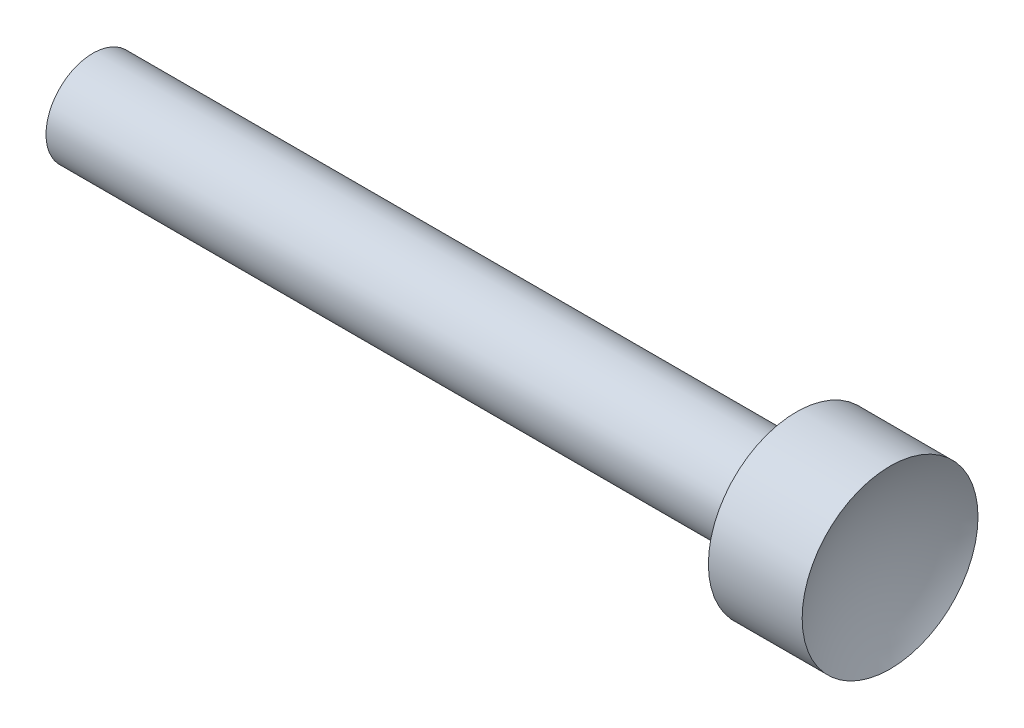
ISO-10303-21;
HEADER;
FILE_DESCRIPTION(('STEP AP214'),'2;1');
FILE_NAME('part.step','',(''),(''),'','','');
FILE_SCHEMA(('AUTOMOTIVE_DESIGN { 1 0 10303 214 1 1 1 1 }'));
ENDSEC;
DATA;
#1=APPLICATION_CONTEXT('core data for automotive mechanical design processes');
#2=APPLICATION_PROTOCOL_DEFINITION('international standard','automotive_design',2000,#1);
#3=PRODUCT_CONTEXT('',#1,'mechanical');
#4=PRODUCT('Part','Part','',(#3));
#5=PRODUCT_RELATED_PRODUCT_CATEGORY('part','',(#4));
#6=PRODUCT_DEFINITION_FORMATION('','',#4);
#7=PRODUCT_DEFINITION_CONTEXT('part definition',#1,'design');
#8=PRODUCT_DEFINITION('design','',#6,#7);
#9=PRODUCT_DEFINITION_SHAPE('','',#8);
#10=(LENGTH_UNIT() NAMED_UNIT(*) SI_UNIT(.MILLI.,.METRE.));
#11=(NAMED_UNIT(*) PLANE_ANGLE_UNIT() SI_UNIT($,.RADIAN.));
#12=(NAMED_UNIT(*) SI_UNIT($,.STERADIAN.) SOLID_ANGLE_UNIT());
#13=UNCERTAINTY_MEASURE_WITH_UNIT(LENGTH_MEASURE(1.E-05),#10,'distance_accuracy_value','');
#14=(GEOMETRIC_REPRESENTATION_CONTEXT(3) GLOBAL_UNCERTAINTY_ASSIGNED_CONTEXT((#13)) GLOBAL_UNIT_ASSIGNED_CONTEXT((#10,
#11,#12)) REPRESENTATION_CONTEXT('',''));
#15=CARTESIAN_POINT('',(0.,0.,0.));
#16=DIRECTION('',(0.,0.,1.));
#17=DIRECTION('',(1.,0.,0.));
#18=AXIS2_PLACEMENT_3D('',#15,#16,#17);
#19=CARTESIAN_POINT('',(6.4369199999409,4.,0.));
#20=DIRECTION('',(1.,0.,0.));
#21=DIRECTION('',(0.,0.,-1.));
#22=AXIS2_PLACEMENT_3D('',#19,#20,#21);
#23=PLANE('',#22);
#24=CARTESIAN_POINT('',(6.4369199999409,0.,0.));
#25=DIRECTION('',(-1.,0.,0.));
#26=DIRECTION('',(0.,0.,1.));
#27=AXIS2_PLACEMENT_3D('',#24,#25,#26);
#28=CIRCLE('',#27,4.);
#29=CARTESIAN_POINT('',(6.4369199999409,0.,4.));
#30=VERTEX_POINT('',#29);
#31=EDGE_CURVE('E51',#30,#30,#28,.T.);
#32=ORIENTED_EDGE('',*,*,#31,.T.);
#33=EDGE_LOOP('',(#32));
#34=FACE_BOUND('',#33,.T.);
#35=ADVANCED_FACE('F40',(#34),#23,.F.);
#36=CARTESIAN_POINT('',(87.4273010567075,0.,0.));
#37=DIRECTION('',(-1.,0.,0.));
#38=DIRECTION('',(0.,1.,0.));
#39=AXIS2_PLACEMENT_3D('',#36,#37,#38);
#40=SPHERICAL_SURFACE('',#39,15.);
#41=CARTESIAN_POINT('',(74.4369199999409,0.,0.));
#42=DIRECTION('',(-1.,0.,0.));
#43=DIRECTION('',(0.,0.,1.));
#44=AXIS2_PLACEMENT_3D('',#41,#42,#43);
#45=CIRCLE('',#44,7.49999999999999);
#46=CARTESIAN_POINT('',(74.4369199999409,0.,7.49999999999999));
#47=VERTEX_POINT('',#46);
#48=EDGE_CURVE('E10',#47,#47,#45,.T.);
#49=ORIENTED_EDGE('',*,*,#48,.F.);
#50=EDGE_LOOP('',(#49));
#51=FACE_BOUND('',#50,.T.);
#52=ADVANCED_FACE('F72',(#51),#40,.F.);
#53=CARTESIAN_POINT('',(0.,0.,0.));
#54=DIRECTION('',(-1.,0.,0.));
#55=DIRECTION('',(0.,0.,1.));
#56=AXIS2_PLACEMENT_3D('',#53,#54,#55);
#57=CYLINDRICAL_SURFACE('',#56,7.49999999999999);
#58=CARTESIAN_POINT('',(66.4369199999409,0.,0.));
#59=DIRECTION('',(-1.,0.,0.));
#60=DIRECTION('',(0.,0.,1.));
#61=AXIS2_PLACEMENT_3D('',#58,#59,#60);
#62=CIRCLE('',#61,7.49999999999999);
#63=CARTESIAN_POINT('',(66.4369199999409,0.,7.49999999999999));
#64=VERTEX_POINT('',#63);
#65=EDGE_CURVE('E43',#64,#64,#62,.T.);
#66=ORIENTED_EDGE('',*,*,#65,.F.);
#67=EDGE_LOOP('',(#66));
#68=FACE_BOUND('',#67,.T.);
#69=ORIENTED_EDGE('',*,*,#48,.T.);
#70=EDGE_LOOP('',(#69));
#71=FACE_BOUND('',#70,.T.);
#72=ADVANCED_FACE('F66',(#68,#71),#57,.T.);
#73=CARTESIAN_POINT('',(66.4369199999409,4.,0.));
#74=DIRECTION('',(1.,0.,0.));
#75=DIRECTION('',(0.,0.,-1.));
#76=AXIS2_PLACEMENT_3D('',#73,#74,#75);
#77=PLANE('',#76);
#78=CARTESIAN_POINT('',(66.4369199999409,0.,0.));
#79=DIRECTION('',(-1.,0.,0.));
#80=DIRECTION('',(0.,0.,1.));
#81=AXIS2_PLACEMENT_3D('',#78,#79,#80);
#82=CIRCLE('',#81,4.);
#83=CARTESIAN_POINT('',(66.4369199999409,0.,4.));
#84=VERTEX_POINT('',#83);
#85=EDGE_CURVE('E50',#84,#84,#82,.T.);
#86=ORIENTED_EDGE('',*,*,#85,.F.);
#87=EDGE_LOOP('',(#86));
#88=FACE_BOUND('',#87,.T.);
#89=ORIENTED_EDGE('',*,*,#65,.T.);
#90=EDGE_LOOP('',(#89));
#91=FACE_BOUND('',#90,.T.);
#92=ADVANCED_FACE('F62',(#88,#91),#77,.F.);
#93=CARTESIAN_POINT('',(0.,0.,0.));
#94=DIRECTION('',(-1.,0.,0.));
#95=DIRECTION('',(0.,0.,1.));
#96=AXIS2_PLACEMENT_3D('',#93,#94,#95);
#97=CYLINDRICAL_SURFACE('',#96,4.);
#98=ORIENTED_EDGE('',*,*,#31,.F.);
#99=EDGE_LOOP('',(#98));
#100=FACE_BOUND('',#99,.T.);
#101=ORIENTED_EDGE('',*,*,#85,.T.);
#102=EDGE_LOOP('',(#101));
#103=FACE_BOUND('',#102,.T.);
#104=ADVANCED_FACE('F59',(#100,#103),#97,.T.);
#105=CLOSED_SHELL('',(#35,#52,#72,#92,#104));
#106=MANIFOLD_SOLID_BREP('B2',#105);
#107=ADVANCED_BREP_SHAPE_REPRESENTATION('',(#18,#106),#14);
#108=SHAPE_DEFINITION_REPRESENTATION(#9,#107);
ENDSEC;
END-ISO-10303-21;
